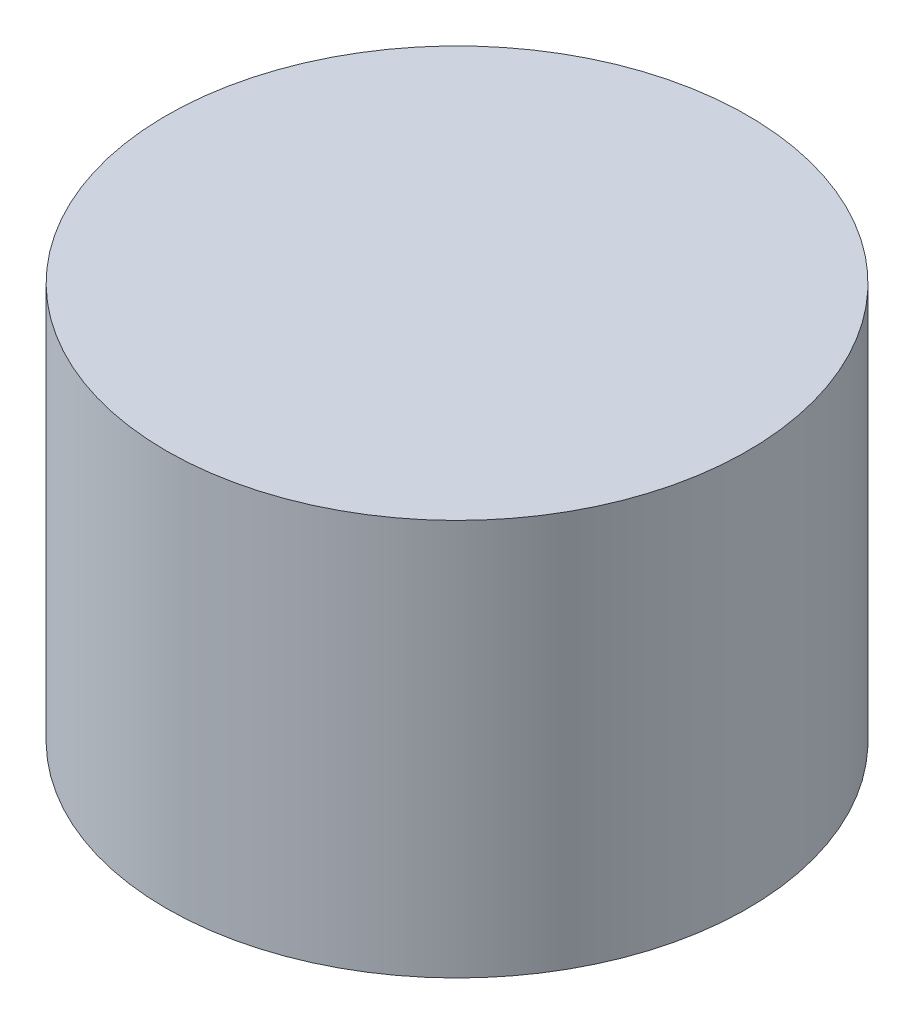
ISO-10303-21;
HEADER;
FILE_DESCRIPTION(('STEP AP214'),'2;1');
FILE_NAME('part.step','',(''),(''),'','','');
FILE_SCHEMA(('AUTOMOTIVE_DESIGN { 1 0 10303 214 1 1 1 1 }'));
ENDSEC;
DATA;
#1=APPLICATION_CONTEXT('core data for automotive mechanical design processes');
#2=APPLICATION_PROTOCOL_DEFINITION('international standard','automotive_design',2000,#1);
#3=PRODUCT_CONTEXT('',#1,'mechanical');
#4=PRODUCT('Part','Part','',(#3));
#5=PRODUCT_RELATED_PRODUCT_CATEGORY('part','',(#4));
#6=PRODUCT_DEFINITION_FORMATION('','',#4);
#7=PRODUCT_DEFINITION_CONTEXT('part definition',#1,'design');
#8=PRODUCT_DEFINITION('design','',#6,#7);
#9=PRODUCT_DEFINITION_SHAPE('','',#8);
#10=(LENGTH_UNIT() NAMED_UNIT(*) SI_UNIT(.MILLI.,.METRE.));
#11=(NAMED_UNIT(*) PLANE_ANGLE_UNIT() SI_UNIT($,.RADIAN.));
#12=(NAMED_UNIT(*) SI_UNIT($,.STERADIAN.) SOLID_ANGLE_UNIT());
#13=UNCERTAINTY_MEASURE_WITH_UNIT(LENGTH_MEASURE(1.E-05),#10,'distance_accuracy_value','');
#14=(GEOMETRIC_REPRESENTATION_CONTEXT(3) GLOBAL_UNCERTAINTY_ASSIGNED_CONTEXT((#13)) GLOBAL_UNIT_ASSIGNED_CONTEXT((#10,
#11,#12)) REPRESENTATION_CONTEXT('',''));
#15=CARTESIAN_POINT('',(0.,0.,0.));
#16=DIRECTION('',(0.,0.,1.));
#17=DIRECTION('',(1.,0.,0.));
#18=AXIS2_PLACEMENT_3D('',#15,#16,#17);
#19=CARTESIAN_POINT('',(0.,0.,0.));
#20=DIRECTION('',(0.,1.,0.));
#21=DIRECTION('',(0.,0.,1.));
#22=AXIS2_PLACEMENT_3D('',#19,#20,#21);
#23=PLANE('',#22);
#24=CARTESIAN_POINT('',(0.,0.,0.));
#25=DIRECTION('',(0.,1.,0.));
#26=DIRECTION('',(0.,0.,1.));
#27=AXIS2_PLACEMENT_3D('',#24,#25,#26);
#28=CIRCLE('',#27,2.2);
#29=CARTESIAN_POINT('',(0.,0.,2.2));
#30=VERTEX_POINT('',#29);
#31=EDGE_CURVE('E10',#30,#30,#28,.T.);
#32=ORIENTED_EDGE('',*,*,#31,.F.);
#33=EDGE_LOOP('',(#32));
#34=FACE_BOUND('',#33,.T.);
#35=CARTESIAN_POINT('',(0.,0.,0.));
#36=DIRECTION('',(0.,1.,0.));
#37=DIRECTION('',(0.,0.,1.));
#38=AXIS2_PLACEMENT_3D('',#35,#36,#37);
#39=CIRCLE('',#38,1.2);
#40=CARTESIAN_POINT('',(0.,0.,1.2));
#41=VERTEX_POINT('',#40);
#42=EDGE_CURVE('E45',#41,#41,#39,.T.);
#43=ORIENTED_EDGE('',*,*,#42,.T.);
#44=EDGE_LOOP('',(#43));
#45=FACE_BOUND('',#44,.T.);
#46=ADVANCED_FACE('F37',(#34,#45),#23,.F.);
#47=CARTESIAN_POINT('',(0.,1.5,0.));
#48=DIRECTION('',(0.,-1.,0.));
#49=DIRECTION('',(0.,0.,-1.));
#50=AXIS2_PLACEMENT_3D('',#47,#48,#49);
#51=CYLINDRICAL_SURFACE('',#50,2.2);
#52=ORIENTED_EDGE('',*,*,#31,.T.);
#53=EDGE_LOOP('',(#52));
#54=FACE_BOUND('',#53,.T.);
#55=CARTESIAN_POINT('',(0.,3.,0.));
#56=DIRECTION('',(0.,1.,0.));
#57=DIRECTION('',(0.,0.,1.));
#58=AXIS2_PLACEMENT_3D('',#55,#56,#57);
#59=CIRCLE('',#58,2.2);
#60=CARTESIAN_POINT('',(0.,3.,2.2));
#61=VERTEX_POINT('',#60);
#62=EDGE_CURVE('E55',#61,#61,#59,.T.);
#63=ORIENTED_EDGE('',*,*,#62,.F.);
#64=EDGE_LOOP('',(#63));
#65=FACE_BOUND('',#64,.T.);
#66=ADVANCED_FACE('F39',(#54,#65),#51,.T.);
#67=CARTESIAN_POINT('',(0.,1.5,0.));
#68=DIRECTION('',(0.,-1.,0.));
#69=DIRECTION('',(0.,0.,-1.));
#70=AXIS2_PLACEMENT_3D('',#67,#68,#69);
#71=CYLINDRICAL_SURFACE('',#70,1.2);
#72=CARTESIAN_POINT('',(0.,1.5,0.));
#73=DIRECTION('',(0.,1.,0.));
#74=DIRECTION('',(0.,0.,1.));
#75=AXIS2_PLACEMENT_3D('',#72,#73,#74);
#76=CIRCLE('',#75,1.2);
#77=CARTESIAN_POINT('',(0.,1.5,1.2));
#78=VERTEX_POINT('',#77);
#79=EDGE_CURVE('E50',#78,#78,#76,.T.);
#80=ORIENTED_EDGE('',*,*,#79,.T.);
#81=EDGE_LOOP('',(#80));
#82=FACE_BOUND('',#81,.T.);
#83=ORIENTED_EDGE('',*,*,#42,.F.);
#84=EDGE_LOOP('',(#83));
#85=FACE_BOUND('',#84,.T.);
#86=ADVANCED_FACE('F65',(#82,#85),#71,.F.);
#87=CARTESIAN_POINT('',(0.,1.5,0.));
#88=DIRECTION('',(0.,1.,0.));
#89=DIRECTION('',(0.,0.,1.));
#90=AXIS2_PLACEMENT_3D('',#87,#88,#89);
#91=PLANE('',#90);
#92=ORIENTED_EDGE('',*,*,#79,.F.);
#93=EDGE_LOOP('',(#92));
#94=FACE_BOUND('',#93,.T.);
#95=ADVANCED_FACE('F70',(#94),#91,.F.);
#96=CARTESIAN_POINT('',(0.,3.,0.));
#97=DIRECTION('',(0.,1.,0.));
#98=DIRECTION('',(0.,0.,1.));
#99=AXIS2_PLACEMENT_3D('',#96,#97,#98);
#100=PLANE('',#99);
#101=ORIENTED_EDGE('',*,*,#62,.T.);
#102=EDGE_LOOP('',(#101));
#103=FACE_BOUND('',#102,.T.);
#104=ADVANCED_FACE('F62',(#103),#100,.T.);
#105=CLOSED_SHELL('',(#46,#66,#86,#95,#104));
#106=MANIFOLD_SOLID_BREP('B2',#105);
#107=ADVANCED_BREP_SHAPE_REPRESENTATION('',(#18,#106),#14);
#108=SHAPE_DEFINITION_REPRESENTATION(#9,#107);
ENDSEC;
END-ISO-10303-21;
